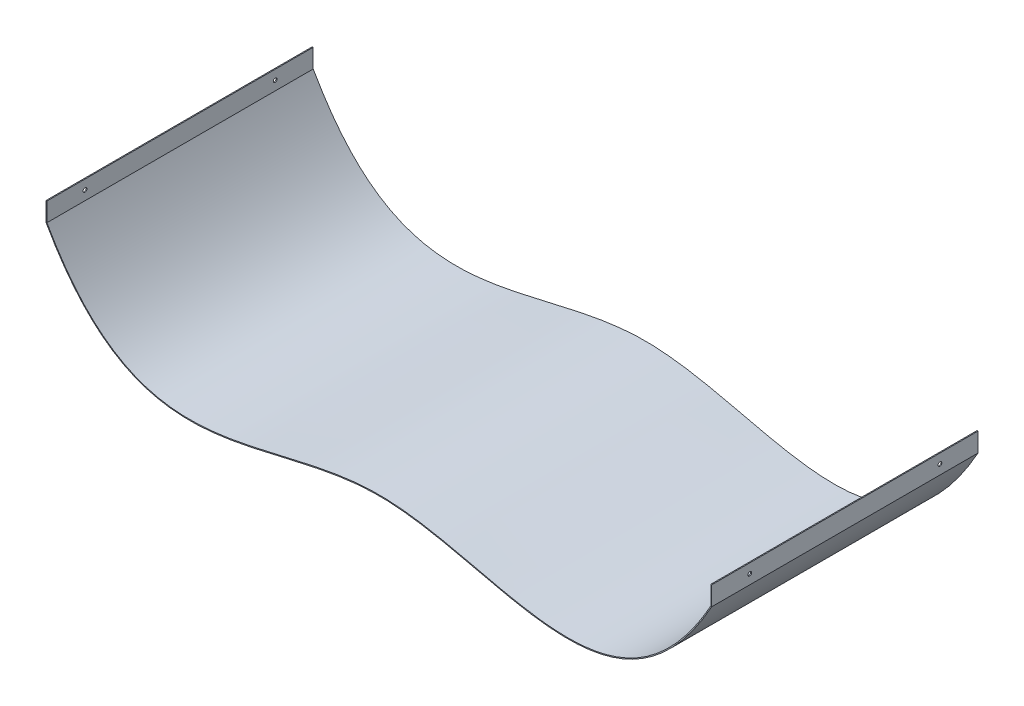
ISO-10303-21;
HEADER;
FILE_DESCRIPTION(('STEP AP214'),'2;1');
FILE_NAME('part.step','',(''),(''),'','','');
FILE_SCHEMA(('AUTOMOTIVE_DESIGN { 1 0 10303 214 1 1 1 1 }'));
ENDSEC;
DATA;
#1=APPLICATION_CONTEXT('core data for automotive mechanical design processes');
#2=APPLICATION_PROTOCOL_DEFINITION('international standard','automotive_design',2000,#1);
#3=PRODUCT_CONTEXT('',#1,'mechanical');
#4=PRODUCT('Part','Part','',(#3));
#5=PRODUCT_RELATED_PRODUCT_CATEGORY('part','',(#4));
#6=PRODUCT_DEFINITION_FORMATION('','',#4);
#7=PRODUCT_DEFINITION_CONTEXT('part definition',#1,'design');
#8=PRODUCT_DEFINITION('design','',#6,#7);
#9=PRODUCT_DEFINITION_SHAPE('','',#8);
#10=(LENGTH_UNIT() NAMED_UNIT(*) SI_UNIT(.MILLI.,.METRE.));
#11=(NAMED_UNIT(*) PLANE_ANGLE_UNIT() SI_UNIT($,.RADIAN.));
#12=(NAMED_UNIT(*) SI_UNIT($,.STERADIAN.) SOLID_ANGLE_UNIT());
#13=UNCERTAINTY_MEASURE_WITH_UNIT(LENGTH_MEASURE(1.E-05),#10,'distance_accuracy_value','');
#14=(GEOMETRIC_REPRESENTATION_CONTEXT(3) GLOBAL_UNCERTAINTY_ASSIGNED_CONTEXT((#13)) GLOBAL_UNIT_ASSIGNED_CONTEXT((#10,
#11,#12)) REPRESENTATION_CONTEXT('',''));
#15=CARTESIAN_POINT('',(0.,0.,0.));
#16=DIRECTION('',(0.,0.,1.));
#17=DIRECTION('',(1.,0.,0.));
#18=AXIS2_PLACEMENT_3D('',#15,#16,#17);
#19=CARTESIAN_POINT('',(350.,90.,280.));
#20=DIRECTION('',(-1.,0.,0.));
#21=DIRECTION('',(0.,0.,1.));
#22=AXIS2_PLACEMENT_3D('',#19,#20,#21);
#23=PLANE('',#22);
#24=CARTESIAN_POINT('',(350.,100.,240.));
#25=DIRECTION('',(-1.,0.,0.));
#26=DIRECTION('',(0.,0.,1.));
#27=AXIS2_PLACEMENT_3D('',#24,#25,#26);
#28=CIRCLE('',#27,2.00000000000003);
#29=CARTESIAN_POINT('',(350.,100.,242.));
#30=VERTEX_POINT('',#29);
#31=EDGE_CURVE('E192',#30,#30,#28,.F.);
#32=ORIENTED_EDGE('',*,*,#31,.F.);
#33=EDGE_LOOP('',(#32));
#34=FACE_BOUND('',#33,.T.);
#35=CARTESIAN_POINT('',(350.,100.,40.));
#36=DIRECTION('',(-1.,0.,0.));
#37=DIRECTION('',(0.,0.,1.));
#38=AXIS2_PLACEMENT_3D('',#35,#36,#37);
#39=CIRCLE('',#38,2.);
#40=CARTESIAN_POINT('',(350.,100.,42.));
#41=VERTEX_POINT('',#40);
#42=EDGE_CURVE('E186',#41,#41,#39,.F.);
#43=ORIENTED_EDGE('',*,*,#42,.F.);
#44=EDGE_LOOP('',(#43));
#45=FACE_BOUND('',#44,.T.);
#46=DIRECTION('',(0.,1.,0.));
#47=VECTOR('',#46,1.);
#48=CARTESIAN_POINT('',(350.,90.,0.));
#49=LINE('',#48,#47);
#50=CARTESIAN_POINT('',(350.,90.,0.));
#51=VERTEX_POINT('',#50);
#52=CARTESIAN_POINT('',(350.,110.,0.));
#53=VERTEX_POINT('',#52);
#54=EDGE_CURVE('E133',#51,#53,#49,.T.);
#55=ORIENTED_EDGE('',*,*,#54,.T.);
#56=DIRECTION('',(0.,0.,-1.));
#57=VECTOR('',#56,1.);
#58=CARTESIAN_POINT('',(350.,110.,280.));
#59=LINE('',#58,#57);
#60=CARTESIAN_POINT('',(350.,110.,280.));
#61=VERTEX_POINT('',#60);
#62=EDGE_CURVE('E11',#61,#53,#59,.T.);
#63=ORIENTED_EDGE('',*,*,#62,.F.);
#64=DIRECTION('',(0.,1.,0.));
#65=VECTOR('',#64,1.);
#66=CARTESIAN_POINT('',(350.,90.,280.));
#67=LINE('',#66,#65);
#68=CARTESIAN_POINT('',(350.,90.,280.));
#69=VERTEX_POINT('',#68);
#70=EDGE_CURVE('E88',#69,#61,#67,.T.);
#71=ORIENTED_EDGE('',*,*,#70,.F.);
#72=DIRECTION('',(0.,0.,-1.));
#73=VECTOR('',#72,1.);
#74=CARTESIAN_POINT('',(350.,90.,280.));
#75=LINE('',#74,#73);
#76=EDGE_CURVE('E132',#69,#51,#75,.T.);
#77=ORIENTED_EDGE('',*,*,#76,.T.);
#78=EDGE_LOOP('',(#55,#63,#71,#77));
#79=FACE_BOUND('',#78,.T.);
#80=ADVANCED_FACE('F33',(#34,#45,#79),#23,.F.);
#81=CARTESIAN_POINT('',(349.,110.,280.));
#82=DIRECTION('',(0.,1.,0.));
#83=DIRECTION('',(0.,0.,1.));
#84=AXIS2_PLACEMENT_3D('',#81,#82,#83);
#85=PLANE('',#84);
#86=DIRECTION('',(1.,0.,0.));
#87=VECTOR('',#86,1.);
#88=CARTESIAN_POINT('',(349.,110.,0.));
#89=LINE('',#88,#87);
#90=CARTESIAN_POINT('',(349.,110.,0.));
#91=VERTEX_POINT('',#90);
#92=EDGE_CURVE('E216',#91,#53,#89,.T.);
#93=ORIENTED_EDGE('',*,*,#92,.F.);
#94=DIRECTION('',(0.,0.,-1.));
#95=VECTOR('',#94,1.);
#96=CARTESIAN_POINT('',(349.,110.,280.));
#97=LINE('',#96,#95);
#98=CARTESIAN_POINT('',(349.,110.,280.));
#99=VERTEX_POINT('',#98);
#100=EDGE_CURVE('E41',#99,#91,#97,.T.);
#101=ORIENTED_EDGE('',*,*,#100,.F.);
#102=DIRECTION('',(1.,0.,0.));
#103=VECTOR('',#102,1.);
#104=CARTESIAN_POINT('',(349.,110.,280.));
#105=LINE('',#104,#103);
#106=EDGE_CURVE('E170',#99,#61,#105,.T.);
#107=ORIENTED_EDGE('',*,*,#106,.T.);
#108=ORIENTED_EDGE('',*,*,#62,.T.);
#109=EDGE_LOOP('',(#93,#101,#107,#108));
#110=FACE_BOUND('',#109,.T.);
#111=ADVANCED_FACE('F203',(#110),#85,.T.);
#112=CARTESIAN_POINT('',(349.,90.,280.));
#113=DIRECTION('',(-1.,0.,0.));
#114=DIRECTION('',(0.,0.,1.));
#115=AXIS2_PLACEMENT_3D('',#112,#113,#114);
#116=PLANE('',#115);
#117=CARTESIAN_POINT('',(349.,100.,240.));
#118=DIRECTION('',(-1.,0.,0.));
#119=DIRECTION('',(0.,0.,1.));
#120=AXIS2_PLACEMENT_3D('',#117,#118,#119);
#121=CIRCLE('',#120,2.00000000000003);
#122=CARTESIAN_POINT('',(349.,100.,242.));
#123=VERTEX_POINT('',#122);
#124=EDGE_CURVE('E195',#123,#123,#121,.T.);
#125=ORIENTED_EDGE('',*,*,#124,.F.);
#126=EDGE_LOOP('',(#125));
#127=FACE_BOUND('',#126,.T.);
#128=CARTESIAN_POINT('',(349.,100.,40.));
#129=DIRECTION('',(-1.,0.,0.));
#130=DIRECTION('',(0.,0.,1.));
#131=AXIS2_PLACEMENT_3D('',#128,#129,#130);
#132=CIRCLE('',#131,2.);
#133=CARTESIAN_POINT('',(349.,100.,42.));
#134=VERTEX_POINT('',#133);
#135=EDGE_CURVE('E189',#134,#134,#132,.T.);
#136=ORIENTED_EDGE('',*,*,#135,.F.);
#137=EDGE_LOOP('',(#136));
#138=FACE_BOUND('',#137,.T.);
#139=DIRECTION('',(0.,1.,0.));
#140=VECTOR('',#139,1.);
#141=CARTESIAN_POINT('',(349.,90.,0.));
#142=LINE('',#141,#140);
#143=CARTESIAN_POINT('',(349.,90.2605119825641,0.));
#144=VERTEX_POINT('',#143);
#145=EDGE_CURVE('E208',#144,#91,#142,.T.);
#146=ORIENTED_EDGE('',*,*,#145,.F.);
#147=DIRECTION('',(0.,0.,-1.));
#148=VECTOR('',#147,1.);
#149=CARTESIAN_POINT('',(349.,90.2605119825641,280.));
#150=LINE('',#149,#148);
#151=CARTESIAN_POINT('',(349.,90.2605119825641,280.));
#152=VERTEX_POINT('',#151);
#153=EDGE_CURVE('E210',#152,#144,#150,.T.);
#154=ORIENTED_EDGE('',*,*,#153,.F.);
#155=DIRECTION('',(0.,1.,0.));
#156=VECTOR('',#155,1.);
#157=CARTESIAN_POINT('',(349.,90.,280.));
#158=LINE('',#157,#156);
#159=EDGE_CURVE('E164',#152,#99,#158,.T.);
#160=ORIENTED_EDGE('',*,*,#159,.T.);
#161=ORIENTED_EDGE('',*,*,#100,.T.);
#162=EDGE_LOOP('',(#146,#154,#160,#161));
#163=FACE_BOUND('',#162,.T.);
#164=ADVANCED_FACE('F157',(#127,#138,#163),#116,.T.);
#165=CARTESIAN_POINT('',(-349.,90.260511982564,280.));
#166=CARTESIAN_POINT('',(-336.47312372523,67.866744435079,280.));
#167=CARTESIAN_POINT('',(-323.57985753796,49.9450261292427,280.));
#168=CARTESIAN_POINT('',(-297.171063328956,21.502335817568,280.));
#169=CARTESIAN_POINT('',(-283.657179578247,10.9805979780306,280.));
#170=CARTESIAN_POINT('',(-256.0886211603,-4.2296106309903,280.));
#171=CARTESIAN_POINT('',(-242.031723713448,-8.92014034575512,280.));
#172=CARTESIAN_POINT('',(-213.417998998411,-14.0039889206443,280.));
#173=CARTESIAN_POINT('',(-198.860178523366,-14.3952919376878,280.));
#174=CARTESIAN_POINT('',(-169.32338685934,-12.3800305589751,280.));
#175=CARTESIAN_POINT('',(-154.345642248506,-9.97304918623494,280.));
#176=CARTESIAN_POINT('',(-124.072626634898,-3.87650404841665,280.));
#177=CARTESIAN_POINT('',(-108.777695252407,-0.187186875698395,280.));
#178=CARTESIAN_POINT('',(-77.9689817392298,6.94599042288741,280.));
#179=CARTESIAN_POINT('',(-62.455111312118,10.3898703806862,280.));
#180=CARTESIAN_POINT('',(-31.3001702287623,15.4968754069671,280.));
#181=CARTESIAN_POINT('',(-15.6585658073261,17.1600935847493,280.));
#182=CARTESIAN_POINT('',(15.6585658073256,17.1600935847493,280.));
#183=CARTESIAN_POINT('',(31.3001702287619,15.4968754069671,280.));
#184=CARTESIAN_POINT('',(62.4551113121176,10.3898703806862,280.));
#185=CARTESIAN_POINT('',(77.9689817392293,6.94599042288736,280.));
#186=CARTESIAN_POINT('',(108.777695252406,-0.187186875698466,280.));
#187=CARTESIAN_POINT('',(124.072626634897,-3.87650404841674,280.));
#188=CARTESIAN_POINT('',(154.345642248506,-9.97304918623505,280.));
#189=CARTESIAN_POINT('',(169.32338685934,-12.3800305589752,280.));
#190=CARTESIAN_POINT('',(198.860178523366,-14.3952919376879,280.));
#191=CARTESIAN_POINT('',(213.417998998411,-14.0039889206444,280.));
#192=CARTESIAN_POINT('',(242.031723713448,-8.92014034575521,280.));
#193=CARTESIAN_POINT('',(256.0886211603,-4.22961063099038,280.));
#194=CARTESIAN_POINT('',(283.657179578246,10.9805979780306,280.));
#195=CARTESIAN_POINT('',(297.171063328956,21.5023358175679,280.));
#196=CARTESIAN_POINT('',(323.579857537959,49.9450261292427,280.));
#197=CARTESIAN_POINT('',(336.47312372523,67.866744435079,280.));
#198=CARTESIAN_POINT('',(349.,90.2605119825641,280.));
#199=B_SPLINE_CURVE_WITH_KNOTS('',3,(#165,#166,#167,#168,#169,#170,#171,#172,#173,#174,#175,
#176,#177,#178,#179,#180,#181,#182,#183,#184,#185,#186,#187,#188,#189,#190,#191,#192,#193,#194,
#195,#196,#197,#198),.UNSPECIFIED.,.F.,.F.,(4,2,2,2,2,2,2,2,2,2,2,2,2,2,2,2,4),(0.,0.0625,0.125,
0.1875,0.25,0.3125,0.375,0.4375,0.5,0.5625,0.625,0.6875,0.75,0.8125,0.875,0.9375,1.),.UNSPECIFIED.);
#200=DIRECTION('',(0.,0.,-1.));
#201=VECTOR('',#200,1.);
#202=SURFACE_OF_LINEAR_EXTRUSION('',#199,#201);
#203=CARTESIAN_POINT('',(-349.,90.260511982564,0.));
#204=CARTESIAN_POINT('',(-336.47312372523,67.866744435079,0.));
#205=CARTESIAN_POINT('',(-323.57985753796,49.9450261292427,0.));
#206=CARTESIAN_POINT('',(-297.171063328956,21.502335817568,0.));
#207=CARTESIAN_POINT('',(-283.657179578247,10.9805979780306,0.));
#208=CARTESIAN_POINT('',(-256.0886211603,-4.2296106309903,0.));
#209=CARTESIAN_POINT('',(-242.031723713448,-8.92014034575512,0.));
#210=CARTESIAN_POINT('',(-213.417998998411,-14.0039889206443,0.));
#211=CARTESIAN_POINT('',(-198.860178523366,-14.3952919376878,0.));
#212=CARTESIAN_POINT('',(-169.32338685934,-12.3800305589751,0.));
#213=CARTESIAN_POINT('',(-154.345642248506,-9.97304918623494,0.));
#214=CARTESIAN_POINT('',(-124.072626634898,-3.87650404841665,0.));
#215=CARTESIAN_POINT('',(-108.777695252407,-0.187186875698395,0.));
#216=CARTESIAN_POINT('',(-77.9689817392298,6.94599042288741,0.));
#217=CARTESIAN_POINT('',(-62.455111312118,10.3898703806862,0.));
#218=CARTESIAN_POINT('',(-31.3001702287623,15.4968754069671,0.));
#219=CARTESIAN_POINT('',(-15.6585658073261,17.1600935847493,0.));
#220=CARTESIAN_POINT('',(15.6585658073256,17.1600935847493,0.));
#221=CARTESIAN_POINT('',(31.3001702287619,15.4968754069671,0.));
#222=CARTESIAN_POINT('',(62.4551113121176,10.3898703806862,0.));
#223=CARTESIAN_POINT('',(77.9689817392293,6.94599042288736,0.));
#224=CARTESIAN_POINT('',(108.777695252406,-0.187186875698466,0.));
#225=CARTESIAN_POINT('',(124.072626634897,-3.87650404841674,0.));
#226=CARTESIAN_POINT('',(154.345642248506,-9.97304918623505,0.));
#227=CARTESIAN_POINT('',(169.32338685934,-12.3800305589752,0.));
#228=CARTESIAN_POINT('',(198.860178523366,-14.3952919376879,0.));
#229=CARTESIAN_POINT('',(213.417998998411,-14.0039889206444,0.));
#230=CARTESIAN_POINT('',(242.031723713448,-8.92014034575521,0.));
#231=CARTESIAN_POINT('',(256.0886211603,-4.22961063099038,0.));
#232=CARTESIAN_POINT('',(283.657179578246,10.9805979780306,0.));
#233=CARTESIAN_POINT('',(297.171063328956,21.5023358175679,0.));
#234=CARTESIAN_POINT('',(323.579857537959,49.9450261292427,0.));
#235=CARTESIAN_POINT('',(336.47312372523,67.866744435079,0.));
#236=CARTESIAN_POINT('',(349.,90.2605119825641,0.));
#237=B_SPLINE_CURVE_WITH_KNOTS('',3,(#203,#204,#205,#206,#207,#208,#209,#210,#211,#212,#213,
#214,#215,#216,#217,#218,#219,#220,#221,#222,#223,#224,#225,#226,#227,#228,#229,#230,#231,#232,
#233,#234,#235,#236),.UNSPECIFIED.,.F.,.F.,(4,2,2,2,2,2,2,2,2,2,2,2,2,2,2,2,4),(0.,0.0625,0.125,
0.1875,0.25,0.3125,0.375,0.4375,0.5,0.5625,0.625,0.6875,0.75,0.8125,0.875,0.9375,1.),.UNSPECIFIED.);
#238=CARTESIAN_POINT('',(-349.,90.260511982564,0.));
#239=VERTEX_POINT('',#238);
#240=EDGE_CURVE('E215',#239,#144,#237,.T.);
#241=ORIENTED_EDGE('',*,*,#240,.F.);
#242=DIRECTION('',(0.,0.,-1.));
#243=VECTOR('',#242,1.);
#244=CARTESIAN_POINT('',(-349.,90.260511982564,280.));
#245=LINE('',#244,#243);
#246=CARTESIAN_POINT('',(-349.,90.260511982564,280.));
#247=VERTEX_POINT('',#246);
#248=EDGE_CURVE('E242',#247,#239,#245,.T.);
#249=ORIENTED_EDGE('',*,*,#248,.F.);
#250=EDGE_CURVE('E124',#247,#152,#199,.T.);
#251=ORIENTED_EDGE('',*,*,#250,.T.);
#252=ORIENTED_EDGE('',*,*,#153,.T.);
#253=EDGE_LOOP('',(#241,#249,#251,#252));
#254=FACE_BOUND('',#253,.T.);
#255=ADVANCED_FACE('F153',(#254),#202,.T.);
#256=CARTESIAN_POINT('',(-349.,90.,280.));
#257=DIRECTION('',(1.,0.,0.));
#258=DIRECTION('',(0.,0.,-1.));
#259=AXIS2_PLACEMENT_3D('',#256,#257,#258);
#260=PLANE('',#259);
#261=CARTESIAN_POINT('',(-349.,100.,40.));
#262=DIRECTION('',(1.,0.,0.));
#263=DIRECTION('',(0.,0.,-1.));
#264=AXIS2_PLACEMENT_3D('',#261,#262,#263);
#265=CIRCLE('',#264,2.);
#266=CARTESIAN_POINT('',(-349.,100.,38.));
#267=VERTEX_POINT('',#266);
#268=EDGE_CURVE('E183',#267,#267,#265,.T.);
#269=ORIENTED_EDGE('',*,*,#268,.F.);
#270=EDGE_LOOP('',(#269));
#271=FACE_BOUND('',#270,.T.);
#272=CARTESIAN_POINT('',(-349.,100.,240.));
#273=DIRECTION('',(1.,0.,0.));
#274=DIRECTION('',(0.,0.,-1.));
#275=AXIS2_PLACEMENT_3D('',#272,#273,#274);
#276=CIRCLE('',#275,2.);
#277=CARTESIAN_POINT('',(-349.,100.,238.));
#278=VERTEX_POINT('',#277);
#279=EDGE_CURVE('E177',#278,#278,#276,.T.);
#280=ORIENTED_EDGE('',*,*,#279,.F.);
#281=EDGE_LOOP('',(#280));
#282=FACE_BOUND('',#281,.T.);
#283=DIRECTION('',(0.,1.,0.));
#284=VECTOR('',#283,1.);
#285=CARTESIAN_POINT('',(-349.,90.,0.));
#286=LINE('',#285,#284);
#287=CARTESIAN_POINT('',(-349.,110.,0.));
#288=VERTEX_POINT('',#287);
#289=EDGE_CURVE('E222',#288,#239,#286,.F.);
#290=ORIENTED_EDGE('',*,*,#289,.F.);
#291=DIRECTION('',(0.,0.,-1.));
#292=VECTOR('',#291,1.);
#293=CARTESIAN_POINT('',(-349.,110.,280.));
#294=LINE('',#293,#292);
#295=CARTESIAN_POINT('',(-349.,110.,280.));
#296=VERTEX_POINT('',#295);
#297=EDGE_CURVE('E112',#296,#288,#294,.T.);
#298=ORIENTED_EDGE('',*,*,#297,.F.);
#299=DIRECTION('',(0.,1.,0.));
#300=VECTOR('',#299,1.);
#301=CARTESIAN_POINT('',(-349.,90.,280.));
#302=LINE('',#301,#300);
#303=EDGE_CURVE('E122',#296,#247,#302,.F.);
#304=ORIENTED_EDGE('',*,*,#303,.T.);
#305=ORIENTED_EDGE('',*,*,#248,.T.);
#306=EDGE_LOOP('',(#290,#298,#304,#305));
#307=FACE_BOUND('',#306,.T.);
#308=ADVANCED_FACE('F150',(#271,#282,#307),#260,.T.);
#309=CARTESIAN_POINT('',(-350.,110.,280.));
#310=DIRECTION('',(0.,1.,0.));
#311=DIRECTION('',(0.,0.,1.));
#312=AXIS2_PLACEMENT_3D('',#309,#310,#311);
#313=PLANE('',#312);
#314=DIRECTION('',(1.,0.,0.));
#315=VECTOR('',#314,1.);
#316=CARTESIAN_POINT('',(-350.,110.,0.));
#317=LINE('',#316,#315);
#318=CARTESIAN_POINT('',(-350.,110.,0.));
#319=VERTEX_POINT('',#318);
#320=EDGE_CURVE('E111',#319,#288,#317,.T.);
#321=ORIENTED_EDGE('',*,*,#320,.F.);
#322=DIRECTION('',(0.,0.,-1.));
#323=VECTOR('',#322,1.);
#324=CARTESIAN_POINT('',(-350.,110.,280.));
#325=LINE('',#324,#323);
#326=CARTESIAN_POINT('',(-350.,110.,280.));
#327=VERTEX_POINT('',#326);
#328=EDGE_CURVE('E105',#327,#319,#325,.T.);
#329=ORIENTED_EDGE('',*,*,#328,.F.);
#330=DIRECTION('',(1.,0.,0.));
#331=VECTOR('',#330,1.);
#332=CARTESIAN_POINT('',(-350.,110.,280.));
#333=LINE('',#332,#331);
#334=EDGE_CURVE('E109',#327,#296,#333,.T.);
#335=ORIENTED_EDGE('',*,*,#334,.T.);
#336=ORIENTED_EDGE('',*,*,#297,.T.);
#337=EDGE_LOOP('',(#321,#329,#335,#336));
#338=FACE_BOUND('',#337,.T.);
#339=ADVANCED_FACE('F107',(#338),#313,.T.);
#340=CARTESIAN_POINT('',(-350.,90.,280.));
#341=DIRECTION('',(1.,0.,0.));
#342=DIRECTION('',(0.,0.,-1.));
#343=AXIS2_PLACEMENT_3D('',#340,#341,#342);
#344=PLANE('',#343);
#345=CARTESIAN_POINT('',(-350.,100.,40.));
#346=DIRECTION('',(1.,0.,0.));
#347=DIRECTION('',(0.,0.,-1.));
#348=AXIS2_PLACEMENT_3D('',#345,#346,#347);
#349=CIRCLE('',#348,2.);
#350=CARTESIAN_POINT('',(-350.,100.,38.));
#351=VERTEX_POINT('',#350);
#352=EDGE_CURVE('E180',#351,#351,#349,.F.);
#353=ORIENTED_EDGE('',*,*,#352,.F.);
#354=EDGE_LOOP('',(#353));
#355=FACE_BOUND('',#354,.T.);
#356=CARTESIAN_POINT('',(-350.,100.,240.));
#357=DIRECTION('',(1.,0.,0.));
#358=DIRECTION('',(0.,0.,-1.));
#359=AXIS2_PLACEMENT_3D('',#356,#357,#358);
#360=CIRCLE('',#359,2.);
#361=CARTESIAN_POINT('',(-350.,100.,238.));
#362=VERTEX_POINT('',#361);
#363=EDGE_CURVE('E174',#362,#362,#360,.F.);
#364=ORIENTED_EDGE('',*,*,#363,.F.);
#365=EDGE_LOOP('',(#364));
#366=FACE_BOUND('',#365,.T.);
#367=DIRECTION('',(0.,-1.,0.));
#368=VECTOR('',#367,1.);
#369=CARTESIAN_POINT('',(-350.,90.,0.));
#370=LINE('',#369,#368);
#371=CARTESIAN_POINT('',(-350.,90.,0.));
#372=VERTEX_POINT('',#371);
#373=EDGE_CURVE('E76',#319,#372,#370,.T.);
#374=ORIENTED_EDGE('',*,*,#373,.T.);
#375=DIRECTION('',(0.,0.,-1.));
#376=VECTOR('',#375,1.);
#377=CARTESIAN_POINT('',(-350.,90.,280.));
#378=LINE('',#377,#376);
#379=CARTESIAN_POINT('',(-350.,90.,280.));
#380=VERTEX_POINT('',#379);
#381=EDGE_CURVE('E113',#380,#372,#378,.T.);
#382=ORIENTED_EDGE('',*,*,#381,.F.);
#383=DIRECTION('',(0.,-1.,0.));
#384=VECTOR('',#383,1.);
#385=CARTESIAN_POINT('',(-350.,90.,280.));
#386=LINE('',#385,#384);
#387=EDGE_CURVE('E115',#327,#380,#386,.T.);
#388=ORIENTED_EDGE('',*,*,#387,.F.);
#389=ORIENTED_EDGE('',*,*,#328,.T.);
#390=EDGE_LOOP('',(#374,#382,#388,#389));
#391=FACE_BOUND('',#390,.T.);
#392=ADVANCED_FACE('F116',(#355,#366,#391),#344,.F.);
#393=CARTESIAN_POINT('',(-350.,90.,280.));
#394=CARTESIAN_POINT('',(-249.509090089464,-89.9213443088968,280.));
#395=CARTESIAN_POINT('',(0.,122.241531478395,280.));
#396=CARTESIAN_POINT('',(249.509090089464,-89.921344308897,280.));
#397=CARTESIAN_POINT('',(350.,90.,280.));
#398=B_SPLINE_CURVE_WITH_KNOTS('',3,(#393,#394,#395,#396,#397),.UNSPECIFIED.,.F.,.F.,(4,1,4),
(0.,0.5,1.),.UNSPECIFIED.);
#399=DIRECTION('',(0.,0.,-1.));
#400=VECTOR('',#399,1.);
#401=SURFACE_OF_LINEAR_EXTRUSION('',#398,#400);
#402=CARTESIAN_POINT('',(-350.,90.,0.));
#403=CARTESIAN_POINT('',(-249.509090089464,-89.9213443088968,0.));
#404=CARTESIAN_POINT('',(0.,122.241531478395,0.));
#405=CARTESIAN_POINT('',(249.509090089464,-89.921344308897,0.));
#406=CARTESIAN_POINT('',(350.,90.,0.));
#407=B_SPLINE_CURVE_WITH_KNOTS('',3,(#402,#403,#404,#405,#406),.UNSPECIFIED.,.F.,.F.,(4,1,4),
(0.,0.5,1.),.UNSPECIFIED.);
#408=EDGE_CURVE('E82',#372,#51,#407,.T.);
#409=ORIENTED_EDGE('',*,*,#408,.T.);
#410=ORIENTED_EDGE('',*,*,#76,.F.);
#411=EDGE_CURVE('E49',#380,#69,#398,.T.);
#412=ORIENTED_EDGE('',*,*,#411,.F.);
#413=ORIENTED_EDGE('',*,*,#381,.T.);
#414=EDGE_LOOP('',(#409,#410,#412,#413));
#415=FACE_BOUND('',#414,.T.);
#416=ADVANCED_FACE('F139',(#415),#401,.F.);
#417=CARTESIAN_POINT('',(0.,17.1600935847493,280.));
#418=DIRECTION('',(0.,0.,-1.));
#419=DIRECTION('',(-1.,0.,0.));
#420=AXIS2_PLACEMENT_3D('',#417,#418,#419);
#421=PLANE('',#420);
#422=ORIENTED_EDGE('',*,*,#70,.T.);
#423=ORIENTED_EDGE('',*,*,#106,.F.);
#424=ORIENTED_EDGE('',*,*,#159,.F.);
#425=ORIENTED_EDGE('',*,*,#250,.F.);
#426=ORIENTED_EDGE('',*,*,#303,.F.);
#427=ORIENTED_EDGE('',*,*,#334,.F.);
#428=ORIENTED_EDGE('',*,*,#387,.T.);
#429=ORIENTED_EDGE('',*,*,#411,.T.);
#430=EDGE_LOOP('',(#422,#423,#424,#425,#426,#427,#428,#429));
#431=FACE_BOUND('',#430,.T.);
#432=ADVANCED_FACE('F119',(#431),#421,.F.);
#433=CARTESIAN_POINT('',(0.,17.1600935847493,0.));
#434=DIRECTION('',(0.,0.,-1.));
#435=DIRECTION('',(-1.,0.,0.));
#436=AXIS2_PLACEMENT_3D('',#433,#434,#435);
#437=PLANE('',#436);
#438=ORIENTED_EDGE('',*,*,#54,.F.);
#439=ORIENTED_EDGE('',*,*,#408,.F.);
#440=ORIENTED_EDGE('',*,*,#373,.F.);
#441=ORIENTED_EDGE('',*,*,#320,.T.);
#442=ORIENTED_EDGE('',*,*,#289,.T.);
#443=ORIENTED_EDGE('',*,*,#240,.T.);
#444=ORIENTED_EDGE('',*,*,#145,.T.);
#445=ORIENTED_EDGE('',*,*,#92,.T.);
#446=EDGE_LOOP('',(#438,#439,#440,#441,#442,#443,#444,#445));
#447=FACE_BOUND('',#446,.T.);
#448=ADVANCED_FACE('F143',(#447),#437,.T.);
#449=CARTESIAN_POINT('',(-355.656854249493,100.,240.));
#450=DIRECTION('',(1.,0.,0.));
#451=DIRECTION('',(0.,0.,-1.));
#452=AXIS2_PLACEMENT_3D('',#449,#450,#451);
#453=CYLINDRICAL_SURFACE('',#452,2.);
#454=ORIENTED_EDGE('',*,*,#363,.T.);
#455=EDGE_LOOP('',(#454));
#456=FACE_BOUND('',#455,.T.);
#457=ORIENTED_EDGE('',*,*,#279,.T.);
#458=EDGE_LOOP('',(#457));
#459=FACE_BOUND('',#458,.T.);
#460=ADVANCED_FACE('F270',(#456,#459),#453,.F.);
#461=CARTESIAN_POINT('',(-355.656854249493,100.,40.));
#462=DIRECTION('',(1.,0.,0.));
#463=DIRECTION('',(0.,0.,-1.));
#464=AXIS2_PLACEMENT_3D('',#461,#462,#463);
#465=CYLINDRICAL_SURFACE('',#464,2.);
#466=ORIENTED_EDGE('',*,*,#352,.T.);
#467=EDGE_LOOP('',(#466));
#468=FACE_BOUND('',#467,.T.);
#469=ORIENTED_EDGE('',*,*,#268,.T.);
#470=EDGE_LOOP('',(#469));
#471=FACE_BOUND('',#470,.T.);
#472=ADVANCED_FACE('F262',(#468,#471),#465,.F.);
#473=CARTESIAN_POINT('',(355.656854249492,100.,40.));
#474=DIRECTION('',(-1.,0.,0.));
#475=DIRECTION('',(0.,0.,1.));
#476=AXIS2_PLACEMENT_3D('',#473,#474,#475);
#477=CYLINDRICAL_SURFACE('',#476,2.);
#478=ORIENTED_EDGE('',*,*,#42,.T.);
#479=EDGE_LOOP('',(#478));
#480=FACE_BOUND('',#479,.T.);
#481=ORIENTED_EDGE('',*,*,#135,.T.);
#482=EDGE_LOOP('',(#481));
#483=FACE_BOUND('',#482,.T.);
#484=ADVANCED_FACE('F259',(#480,#483),#477,.F.);
#485=CARTESIAN_POINT('',(355.656854249492,100.,240.));
#486=DIRECTION('',(-1.,0.,0.));
#487=DIRECTION('',(0.,0.,1.));
#488=AXIS2_PLACEMENT_3D('',#485,#486,#487);
#489=CYLINDRICAL_SURFACE('',#488,2.00000000000003);
#490=ORIENTED_EDGE('',*,*,#31,.T.);
#491=EDGE_LOOP('',(#490));
#492=FACE_BOUND('',#491,.T.);
#493=ORIENTED_EDGE('',*,*,#124,.T.);
#494=EDGE_LOOP('',(#493));
#495=FACE_BOUND('',#494,.T.);
#496=ADVANCED_FACE('F199',(#492,#495),#489,.F.);
#497=CLOSED_SHELL('',(#80,#111,#164,#255,#308,#339,#392,#416,#432,#448,#460,#472,#484,#496));
#498=MANIFOLD_SOLID_BREP('B2',#497);
#499=ADVANCED_BREP_SHAPE_REPRESENTATION('',(#18,#498),#14);
#500=SHAPE_DEFINITION_REPRESENTATION(#9,#499);
ENDSEC;
END-ISO-10303-21;
